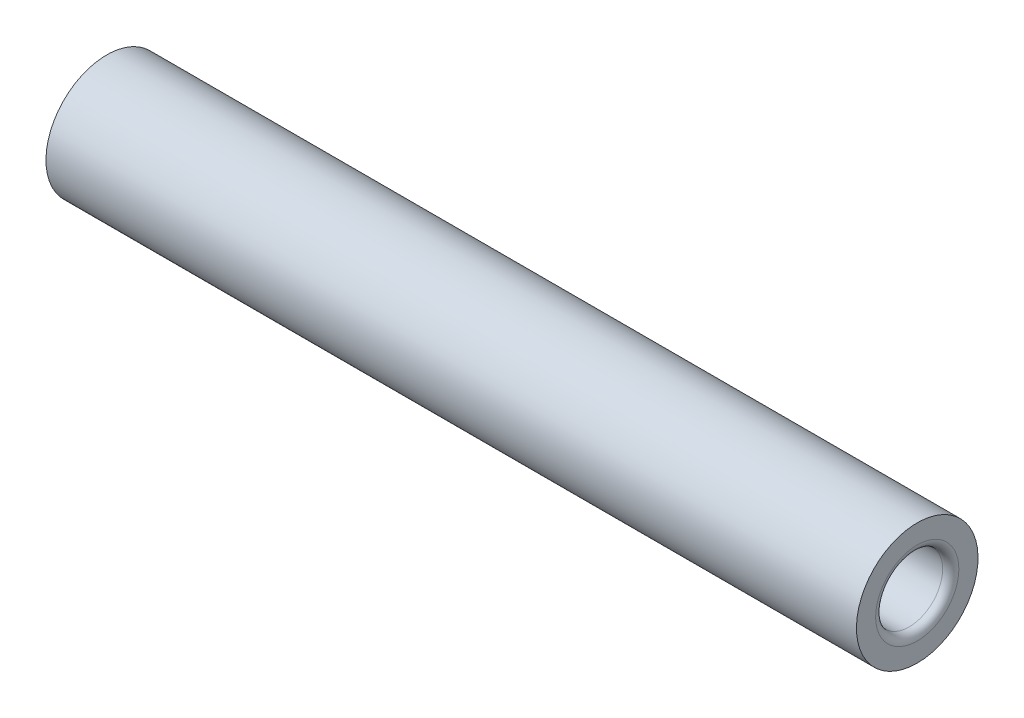
ISO-10303-21;
HEADER;
FILE_DESCRIPTION(('STEP AP214'),'2;1');
FILE_NAME('part.step','',(''),(''),'','','');
FILE_SCHEMA(('AUTOMOTIVE_DESIGN { 1 0 10303 214 1 1 1 1 }'));
ENDSEC;
DATA;
#1=APPLICATION_CONTEXT('core data for automotive mechanical design processes');
#2=APPLICATION_PROTOCOL_DEFINITION('international standard','automotive_design',2000,#1);
#3=PRODUCT_CONTEXT('',#1,'mechanical');
#4=PRODUCT('Part','Part','',(#3));
#5=PRODUCT_RELATED_PRODUCT_CATEGORY('part','',(#4));
#6=PRODUCT_DEFINITION_FORMATION('','',#4);
#7=PRODUCT_DEFINITION_CONTEXT('part definition',#1,'design');
#8=PRODUCT_DEFINITION('design','',#6,#7);
#9=PRODUCT_DEFINITION_SHAPE('','',#8);
#10=(LENGTH_UNIT() NAMED_UNIT(*) SI_UNIT(.MILLI.,.METRE.));
#11=(NAMED_UNIT(*) PLANE_ANGLE_UNIT() SI_UNIT($,.RADIAN.));
#12=(NAMED_UNIT(*) SI_UNIT($,.STERADIAN.) SOLID_ANGLE_UNIT());
#13=UNCERTAINTY_MEASURE_WITH_UNIT(LENGTH_MEASURE(1.E-05),#10,'distance_accuracy_value','');
#14=(GEOMETRIC_REPRESENTATION_CONTEXT(3) GLOBAL_UNCERTAINTY_ASSIGNED_CONTEXT((#13)) GLOBAL_UNIT_ASSIGNED_CONTEXT((#10,
#11,#12)) REPRESENTATION_CONTEXT('',''));
#15=CARTESIAN_POINT('',(0.,0.,0.));
#16=DIRECTION('',(0.,0.,1.));
#17=DIRECTION('',(1.,0.,0.));
#18=AXIS2_PLACEMENT_3D('',#15,#16,#17);
#19=CARTESIAN_POINT('',(0.,0.,0.));
#20=DIRECTION('',(-1.,0.,0.));
#21=DIRECTION('',(0.,-1.,0.));
#22=AXIS2_PLACEMENT_3D('',#19,#20,#21);
#23=PLANE('',#22);
#24=CARTESIAN_POINT('',(0.,3.80999999999999,0.));
#25=DIRECTION('',(-1.,0.,0.));
#26=DIRECTION('',(0.,-1.,0.));
#27=AXIS2_PLACEMENT_3D('',#24,#25,#26);
#28=CIRCLE('',#27,2.608);
#29=CARTESIAN_POINT('',(0.,1.20199999999999,0.));
#30=VERTEX_POINT('',#29);
#31=EDGE_CURVE('E11',#30,#30,#28,.F.);
#32=ORIENTED_EDGE('',*,*,#31,.T.);
#33=EDGE_LOOP('',(#32));
#34=FACE_BOUND('',#33,.T.);
#35=CARTESIAN_POINT('',(0.,3.81,0.));
#36=DIRECTION('',(-1.,0.,0.));
#37=DIRECTION('',(0.,-1.,0.));
#38=AXIS2_PLACEMENT_3D('',#35,#36,#37);
#39=CIRCLE('',#38,3.81);
#40=CARTESIAN_POINT('',(0.,0.,0.));
#41=VERTEX_POINT('',#40);
#42=EDGE_CURVE('E66',#41,#41,#39,.T.);
#43=ORIENTED_EDGE('',*,*,#42,.T.);
#44=EDGE_LOOP('',(#43));
#45=FACE_BOUND('',#44,.T.);
#46=ADVANCED_FACE('F34',(#34,#45),#23,.T.);
#47=CARTESIAN_POINT('',(50.8,0.,0.));
#48=DIRECTION('',(1.,0.,0.));
#49=DIRECTION('',(0.,1.,0.));
#50=AXIS2_PLACEMENT_3D('',#47,#48,#49);
#51=PLANE('',#50);
#52=CARTESIAN_POINT('',(50.8,3.80999999999999,0.));
#53=DIRECTION('',(1.,0.,0.));
#54=DIRECTION('',(0.,1.,0.));
#55=AXIS2_PLACEMENT_3D('',#52,#53,#54);
#56=CIRCLE('',#55,2.608);
#57=CARTESIAN_POINT('',(50.8,6.41799999999999,0.));
#58=VERTEX_POINT('',#57);
#59=EDGE_CURVE('E72',#58,#58,#56,.F.);
#60=ORIENTED_EDGE('',*,*,#59,.T.);
#61=EDGE_LOOP('',(#60));
#62=FACE_BOUND('',#61,.T.);
#63=CARTESIAN_POINT('',(50.8,3.80999999999999,0.));
#64=DIRECTION('',(-1.,0.,0.));
#65=DIRECTION('',(0.,-1.,0.));
#66=AXIS2_PLACEMENT_3D('',#63,#64,#65);
#67=CIRCLE('',#66,3.80999999999999);
#68=CARTESIAN_POINT('',(50.8,0.,0.));
#69=VERTEX_POINT('',#68);
#70=EDGE_CURVE('E61',#69,#69,#67,.T.);
#71=ORIENTED_EDGE('',*,*,#70,.F.);
#72=EDGE_LOOP('',(#71));
#73=FACE_BOUND('',#72,.T.);
#74=ADVANCED_FACE('F88',(#62,#73),#51,.T.);
#75=CARTESIAN_POINT('',(0.,3.81,0.));
#76=DIRECTION('',(-1.,0.,0.));
#77=DIRECTION('',(0.,-1.,0.));
#78=AXIS2_PLACEMENT_3D('',#75,#76,#77);
#79=CYLINDRICAL_SURFACE('',#78,3.80999999999999);
#80=ORIENTED_EDGE('',*,*,#70,.T.);
#81=EDGE_LOOP('',(#80));
#82=FACE_BOUND('',#81,.T.);
#83=ORIENTED_EDGE('',*,*,#42,.F.);
#84=EDGE_LOOP('',(#83));
#85=FACE_BOUND('',#84,.T.);
#86=ADVANCED_FACE('F94',(#82,#85),#79,.T.);
#87=CARTESIAN_POINT('',(8.89,3.80999999999999,0.));
#88=DIRECTION('',(-1.,0.,0.));
#89=DIRECTION('',(0.,0.,1.));
#90=AXIS2_PLACEMENT_3D('',#87,#88,#89);
#91=CONICAL_SURFACE('',#90,2.1,1.02974425867665);
#92=CARTESIAN_POINT('',(10.1518072999579,3.80999999999999,0.));
#93=VERTEX_POINT('',#92);
#94=VERTEX_LOOP('',#93);
#95=FACE_BOUND('',#94,.T.);
#96=CARTESIAN_POINT('',(8.89,3.80999999999999,0.));
#97=DIRECTION('',(-1.,0.,0.));
#98=DIRECTION('',(0.,0.,1.));
#99=AXIS2_PLACEMENT_3D('',#96,#97,#98);
#100=CIRCLE('',#99,2.1);
#101=CARTESIAN_POINT('',(8.89,3.80999999999999,2.1));
#102=VERTEX_POINT('',#101);
#103=EDGE_CURVE('E58',#102,#102,#100,.T.);
#104=ORIENTED_EDGE('',*,*,#103,.T.);
#105=EDGE_LOOP('',(#104));
#106=FACE_BOUND('',#105,.T.);
#107=ADVANCED_FACE('F101',(#95,#106),#91,.F.);
#108=CARTESIAN_POINT('',(0.,3.80999999999999,0.));
#109=DIRECTION('',(-1.,0.,0.));
#110=DIRECTION('',(0.,0.,1.));
#111=AXIS2_PLACEMENT_3D('',#108,#109,#110);
#112=CYLINDRICAL_SURFACE('',#111,2.1);
#113=CARTESIAN_POINT('',(0.508,3.80999999999999,0.));
#114=DIRECTION('',(-1.,0.,0.));
#115=DIRECTION('',(0.,-1.,0.));
#116=AXIS2_PLACEMENT_3D('',#113,#114,#115);
#117=CIRCLE('',#116,2.1);
#118=CARTESIAN_POINT('',(0.508,1.70999999999999,0.));
#119=VERTEX_POINT('',#118);
#120=EDGE_CURVE('E42',#119,#119,#117,.T.);
#121=ORIENTED_EDGE('',*,*,#120,.T.);
#122=EDGE_LOOP('',(#121));
#123=FACE_BOUND('',#122,.T.);
#124=ORIENTED_EDGE('',*,*,#103,.F.);
#125=EDGE_LOOP('',(#124));
#126=FACE_BOUND('',#125,.T.);
#127=ADVANCED_FACE('F52',(#123,#126),#112,.F.);
#128=CARTESIAN_POINT('',(41.91,3.80999999999999,0.));
#129=DIRECTION('',(1.,0.,0.));
#130=DIRECTION('',(0.,0.,-1.));
#131=AXIS2_PLACEMENT_3D('',#128,#129,#130);
#132=CONICAL_SURFACE('',#131,2.1,1.02974425867665);
#133=CARTESIAN_POINT('',(40.6481927000421,3.80999999999999,0.));
#134=VERTEX_POINT('',#133);
#135=VERTEX_LOOP('',#134);
#136=FACE_BOUND('',#135,.T.);
#137=CARTESIAN_POINT('',(41.91,3.80999999999999,0.));
#138=DIRECTION('',(1.,0.,0.));
#139=DIRECTION('',(0.,0.,-1.));
#140=AXIS2_PLACEMENT_3D('',#137,#138,#139);
#141=CIRCLE('',#140,2.1);
#142=CARTESIAN_POINT('',(41.91,3.80999999999999,-2.1));
#143=VERTEX_POINT('',#142);
#144=EDGE_CURVE('E56',#143,#143,#141,.T.);
#145=ORIENTED_EDGE('',*,*,#144,.T.);
#146=EDGE_LOOP('',(#145));
#147=FACE_BOUND('',#146,.T.);
#148=ADVANCED_FACE('F48',(#136,#147),#132,.F.);
#149=CARTESIAN_POINT('',(50.8,3.80999999999999,0.));
#150=DIRECTION('',(1.,0.,0.));
#151=DIRECTION('',(0.,0.,-1.));
#152=AXIS2_PLACEMENT_3D('',#149,#150,#151);
#153=CYLINDRICAL_SURFACE('',#152,2.1);
#154=CARTESIAN_POINT('',(50.292,3.80999999999999,0.));
#155=DIRECTION('',(1.,0.,0.));
#156=DIRECTION('',(0.,1.,0.));
#157=AXIS2_PLACEMENT_3D('',#154,#155,#156);
#158=CIRCLE('',#157,2.1);
#159=CARTESIAN_POINT('',(50.292,5.90999999999999,0.));
#160=VERTEX_POINT('',#159);
#161=EDGE_CURVE('E69',#160,#160,#158,.T.);
#162=ORIENTED_EDGE('',*,*,#161,.T.);
#163=EDGE_LOOP('',(#162));
#164=FACE_BOUND('',#163,.T.);
#165=ORIENTED_EDGE('',*,*,#144,.F.);
#166=EDGE_LOOP('',(#165));
#167=FACE_BOUND('',#166,.T.);
#168=ADVANCED_FACE('F51',(#164,#167),#153,.F.);
#169=CARTESIAN_POINT('',(50.292,3.80999999999999,0.));
#170=DIRECTION('',(1.,0.,0.));
#171=DIRECTION('',(0.,1.,0.));
#172=AXIS2_PLACEMENT_3D('',#169,#170,#171);
#173=TOROIDAL_SURFACE('',#172,2.608,0.508);
#174=ORIENTED_EDGE('',*,*,#59,.F.);
#175=EDGE_LOOP('',(#174));
#176=FACE_BOUND('',#175,.T.);
#177=ORIENTED_EDGE('',*,*,#161,.F.);
#178=EDGE_LOOP('',(#177));
#179=FACE_BOUND('',#178,.T.);
#180=ADVANCED_FACE('F80',(#176,#179),#173,.T.);
#181=CARTESIAN_POINT('',(0.508,3.80999999999999,0.));
#182=DIRECTION('',(-1.,0.,0.));
#183=DIRECTION('',(0.,-1.,0.));
#184=AXIS2_PLACEMENT_3D('',#181,#182,#183);
#185=TOROIDAL_SURFACE('',#184,2.608,0.508);
#186=ORIENTED_EDGE('',*,*,#31,.F.);
#187=EDGE_LOOP('',(#186));
#188=FACE_BOUND('',#187,.T.);
#189=ORIENTED_EDGE('',*,*,#120,.F.);
#190=EDGE_LOOP('',(#189));
#191=FACE_BOUND('',#190,.T.);
#192=ADVANCED_FACE('F36',(#188,#191),#185,.T.);
#193=CLOSED_SHELL('',(#46,#74,#86,#107,#127,#148,#168,#180,#192));
#194=MANIFOLD_SOLID_BREP('B2',#193);
#195=ADVANCED_BREP_SHAPE_REPRESENTATION('',(#18,#194),#14);
#196=SHAPE_DEFINITION_REPRESENTATION(#9,#195);
ENDSEC;
END-ISO-10303-21;
